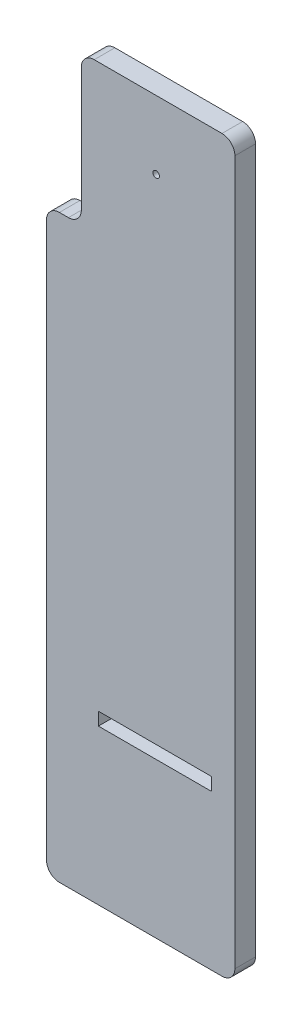
ISO-10303-21;
HEADER;
FILE_DESCRIPTION(('STEP AP214'),'2;1');
FILE_NAME('part.step','',(''),(''),'','','');
FILE_SCHEMA(('AUTOMOTIVE_DESIGN { 1 0 10303 214 1 1 1 1 }'));
ENDSEC;
DATA;
#1=APPLICATION_CONTEXT('core data for automotive mechanical design processes');
#2=APPLICATION_PROTOCOL_DEFINITION('international standard','automotive_design',2000,#1);
#3=PRODUCT_CONTEXT('',#1,'mechanical');
#4=PRODUCT('Part','Part','',(#3));
#5=PRODUCT_RELATED_PRODUCT_CATEGORY('part','',(#4));
#6=PRODUCT_DEFINITION_FORMATION('','',#4);
#7=PRODUCT_DEFINITION_CONTEXT('part definition',#1,'design');
#8=PRODUCT_DEFINITION('design','',#6,#7);
#9=PRODUCT_DEFINITION_SHAPE('','',#8);
#10=(LENGTH_UNIT() NAMED_UNIT(*) SI_UNIT(.MILLI.,.METRE.));
#11=(NAMED_UNIT(*) PLANE_ANGLE_UNIT() SI_UNIT($,.RADIAN.));
#12=(NAMED_UNIT(*) SI_UNIT($,.STERADIAN.) SOLID_ANGLE_UNIT());
#13=UNCERTAINTY_MEASURE_WITH_UNIT(LENGTH_MEASURE(1.E-05),#10,'distance_accuracy_value','');
#14=(GEOMETRIC_REPRESENTATION_CONTEXT(3) GLOBAL_UNCERTAINTY_ASSIGNED_CONTEXT((#13)) GLOBAL_UNIT_ASSIGNED_CONTEXT((#10,
#11,#12)) REPRESENTATION_CONTEXT('',''));
#15=CARTESIAN_POINT('',(0.,0.,0.));
#16=DIRECTION('',(0.,0.,1.));
#17=DIRECTION('',(1.,0.,0.));
#18=AXIS2_PLACEMENT_3D('',#15,#16,#17);
#19=CARTESIAN_POINT('',(0.,0.,1.6));
#20=DIRECTION('',(0.,0.,1.));
#21=DIRECTION('',(1.,0.,0.));
#22=AXIS2_PLACEMENT_3D('',#19,#20,#21);
#23=PLANE('',#22);
#24=DIRECTION('',(1.,0.,0.));
#25=VECTOR('',#24,1.);
#26=CARTESIAN_POINT('',(6.44999999999999,-22.48,1.6));
#27=LINE('',#26,#25);
#28=CARTESIAN_POINT('',(-7.15000000000001,-22.48,1.6));
#29=VERTEX_POINT('',#28);
#30=CARTESIAN_POINT('',(5.44999999999999,-22.48,1.6));
#31=VERTEX_POINT('',#30);
#32=EDGE_CURVE('E208',#29,#31,#27,.T.);
#33=ORIENTED_EDGE('',*,*,#32,.T.);
#34=CARTESIAN_POINT('',(5.44999999999999,-21.48,1.6));
#35=DIRECTION('',(0.,0.,1.));
#36=DIRECTION('',(1.,0.,0.));
#37=AXIS2_PLACEMENT_3D('',#34,#35,#36);
#38=CIRCLE('',#37,1.);
#39=CARTESIAN_POINT('',(6.44999999999999,-21.48,1.6));
#40=VERTEX_POINT('',#39);
#41=EDGE_CURVE('E247',#31,#40,#38,.T.);
#42=ORIENTED_EDGE('',*,*,#41,.T.);
#43=DIRECTION('',(0.,1.,0.));
#44=VECTOR('',#43,1.);
#45=CARTESIAN_POINT('',(6.44999999999999,-22.48,1.6));
#46=LINE('',#45,#44);
#47=CARTESIAN_POINT('',(6.44999999999999,33.08,1.6));
#48=VERTEX_POINT('',#47);
#49=EDGE_CURVE('E200',#40,#48,#46,.T.);
#50=ORIENTED_EDGE('',*,*,#49,.T.);
#51=CARTESIAN_POINT('',(5.44999999999999,33.08,1.6));
#52=DIRECTION('',(0.,0.,1.));
#53=DIRECTION('',(1.,0.,0.));
#54=AXIS2_PLACEMENT_3D('',#51,#52,#53);
#55=CIRCLE('',#54,1.);
#56=CARTESIAN_POINT('',(5.44999999999999,34.08,1.6));
#57=VERTEX_POINT('',#56);
#58=EDGE_CURVE('E63',#48,#57,#55,.T.);
#59=ORIENTED_EDGE('',*,*,#58,.T.);
#60=DIRECTION('',(-1.,0.,0.));
#61=VECTOR('',#60,1.);
#62=CARTESIAN_POINT('',(6.44999999999999,34.08,1.6));
#63=LINE('',#62,#61);
#64=CARTESIAN_POINT('',(-4.44999999999997,34.08,1.6));
#65=VERTEX_POINT('',#64);
#66=EDGE_CURVE('E202',#57,#65,#63,.T.);
#67=ORIENTED_EDGE('',*,*,#66,.T.);
#68=CARTESIAN_POINT('',(-4.44999999999997,33.08,1.6));
#69=DIRECTION('',(0.,0.,1.));
#70=DIRECTION('',(1.,0.,0.));
#71=AXIS2_PLACEMENT_3D('',#68,#69,#70);
#72=CIRCLE('',#71,1.);
#73=CARTESIAN_POINT('',(-5.44999999999997,33.08,1.6));
#74=VERTEX_POINT('',#73);
#75=EDGE_CURVE('E240',#65,#74,#72,.T.);
#76=ORIENTED_EDGE('',*,*,#75,.T.);
#77=DIRECTION('',(0.,-1.,0.));
#78=VECTOR('',#77,1.);
#79=CARTESIAN_POINT('',(-5.44999999999997,34.08,1.6));
#80=LINE('',#79,#78);
#81=CARTESIAN_POINT('',(-5.44999999999997,23.48,1.6));
#82=VERTEX_POINT('',#81);
#83=EDGE_CURVE('E291',#74,#82,#80,.T.);
#84=ORIENTED_EDGE('',*,*,#83,.T.);
#85=CARTESIAN_POINT('',(-6.44999999999997,23.48,1.6));
#86=DIRECTION('',(0.,0.,1.));
#87=DIRECTION('',(1.,0.,0.));
#88=AXIS2_PLACEMENT_3D('',#85,#86,#87);
#89=CIRCLE('',#88,1.);
#90=CARTESIAN_POINT('',(-6.44999999999997,22.48,1.6));
#91=VERTEX_POINT('',#90);
#92=EDGE_CURVE('E11',#82,#91,#89,.F.);
#93=ORIENTED_EDGE('',*,*,#92,.T.);
#94=DIRECTION('',(-1.,0.,0.));
#95=VECTOR('',#94,1.);
#96=CARTESIAN_POINT('',(-5.44999999999997,22.48,1.6));
#97=LINE('',#96,#95);
#98=CARTESIAN_POINT('',(-7.15000000000001,22.48,1.6));
#99=VERTEX_POINT('',#98);
#100=EDGE_CURVE('E289',#91,#99,#97,.T.);
#101=ORIENTED_EDGE('',*,*,#100,.T.);
#102=CARTESIAN_POINT('',(-7.15000000000001,21.48,1.6));
#103=DIRECTION('',(0.,0.,1.));
#104=DIRECTION('',(1.,0.,0.));
#105=AXIS2_PLACEMENT_3D('',#102,#103,#104);
#106=CIRCLE('',#105,1.);
#107=CARTESIAN_POINT('',(-8.15000000000001,21.48,1.6));
#108=VERTEX_POINT('',#107);
#109=EDGE_CURVE('E243',#99,#108,#106,.T.);
#110=ORIENTED_EDGE('',*,*,#109,.T.);
#111=DIRECTION('',(0.,-1.,0.));
#112=VECTOR('',#111,1.);
#113=CARTESIAN_POINT('',(-8.15000000000001,-22.48,1.6));
#114=LINE('',#113,#112);
#115=CARTESIAN_POINT('',(-8.15000000000001,-21.48,1.6));
#116=VERTEX_POINT('',#115);
#117=EDGE_CURVE('E205',#108,#116,#114,.T.);
#118=ORIENTED_EDGE('',*,*,#117,.T.);
#119=CARTESIAN_POINT('',(-7.15000000000001,-21.48,1.6));
#120=DIRECTION('',(0.,0.,1.));
#121=DIRECTION('',(1.,0.,0.));
#122=AXIS2_PLACEMENT_3D('',#119,#120,#121);
#123=CIRCLE('',#122,1.);
#124=EDGE_CURVE('E245',#116,#29,#123,.T.);
#125=ORIENTED_EDGE('',*,*,#124,.T.);
#126=EDGE_LOOP('',(#33,#42,#50,#59,#67,#76,#84,#93,#101,#110,#118,#125));
#127=FACE_BOUND('',#126,.T.);
#128=DIRECTION('',(-1.,0.,0.));
#129=VECTOR('',#128,1.);
#130=CARTESIAN_POINT('',(4.62499999999999,-9.48000000000001,1.6));
#131=LINE('',#130,#129);
#132=CARTESIAN_POINT('',(4.62499999999999,-9.48000000000001,1.6));
#133=VERTEX_POINT('',#132);
#134=CARTESIAN_POINT('',(-4.125,-9.48000000000001,1.6));
#135=VERTEX_POINT('',#134);
#136=EDGE_CURVE('E166',#133,#135,#131,.T.);
#137=ORIENTED_EDGE('',*,*,#136,.F.);
#138=DIRECTION('',(0.,1.,0.));
#139=VECTOR('',#138,1.);
#140=CARTESIAN_POINT('',(4.62499999999999,-10.48,1.6));
#141=LINE('',#140,#139);
#142=CARTESIAN_POINT('',(4.62499999999999,-10.48,1.6));
#143=VERTEX_POINT('',#142);
#144=EDGE_CURVE('E156',#143,#133,#141,.T.);
#145=ORIENTED_EDGE('',*,*,#144,.F.);
#146=DIRECTION('',(1.,0.,0.));
#147=VECTOR('',#146,1.);
#148=CARTESIAN_POINT('',(4.62499999999999,-10.48,1.6));
#149=LINE('',#148,#147);
#150=CARTESIAN_POINT('',(-4.125,-10.48,1.6));
#151=VERTEX_POINT('',#150);
#152=EDGE_CURVE('E182',#151,#143,#149,.T.);
#153=ORIENTED_EDGE('',*,*,#152,.F.);
#154=DIRECTION('',(0.,-1.,0.));
#155=VECTOR('',#154,1.);
#156=CARTESIAN_POINT('',(-4.125,-10.48,1.6));
#157=LINE('',#156,#155);
#158=EDGE_CURVE('E180',#135,#151,#157,.T.);
#159=ORIENTED_EDGE('',*,*,#158,.F.);
#160=EDGE_LOOP('',(#137,#145,#153,#159));
#161=FACE_BOUND('',#160,.T.);
#162=CARTESIAN_POINT('',(0.350000000000027,28.78,1.6));
#163=DIRECTION('',(0.,0.,1.));
#164=DIRECTION('',(1.,0.,0.));
#165=AXIS2_PLACEMENT_3D('',#162,#163,#164);
#166=CIRCLE('',#165,0.25);
#167=CARTESIAN_POINT('',(0.600000000000028,28.78,1.6));
#168=VERTEX_POINT('',#167);
#169=EDGE_CURVE('E189',#168,#168,#166,.T.);
#170=ORIENTED_EDGE('',*,*,#169,.F.);
#171=EDGE_LOOP('',(#170));
#172=FACE_BOUND('',#171,.T.);
#173=ADVANCED_FACE('F41',(#127,#161,#172),#23,.T.);
#174=CARTESIAN_POINT('',(0.,0.,0.));
#175=DIRECTION('',(0.,0.,1.));
#176=DIRECTION('',(1.,0.,0.));
#177=AXIS2_PLACEMENT_3D('',#174,#175,#176);
#178=PLANE('',#177);
#179=DIRECTION('',(0.,1.,0.));
#180=VECTOR('',#179,1.);
#181=CARTESIAN_POINT('',(6.44999999999999,-22.48,0.));
#182=LINE('',#181,#180);
#183=CARTESIAN_POINT('',(6.44999999999999,-21.48,0.));
#184=VERTEX_POINT('',#183);
#185=CARTESIAN_POINT('',(6.44999999999999,33.08,0.));
#186=VERTEX_POINT('',#185);
#187=EDGE_CURVE('E174',#184,#186,#182,.T.);
#188=ORIENTED_EDGE('',*,*,#187,.F.);
#189=CARTESIAN_POINT('',(5.44999999999999,-21.48,0.));
#190=DIRECTION('',(0.,0.,1.));
#191=DIRECTION('',(1.,0.,0.));
#192=AXIS2_PLACEMENT_3D('',#189,#190,#191);
#193=CIRCLE('',#192,1.);
#194=CARTESIAN_POINT('',(5.44999999999999,-22.48,0.));
#195=VERTEX_POINT('',#194);
#196=EDGE_CURVE('E233',#184,#195,#193,.F.);
#197=ORIENTED_EDGE('',*,*,#196,.T.);
#198=DIRECTION('',(1.,0.,0.));
#199=VECTOR('',#198,1.);
#200=CARTESIAN_POINT('',(6.44999999999999,-22.48,0.));
#201=LINE('',#200,#199);
#202=CARTESIAN_POINT('',(-7.15000000000001,-22.48,0.));
#203=VERTEX_POINT('',#202);
#204=EDGE_CURVE('E203',#203,#195,#201,.T.);
#205=ORIENTED_EDGE('',*,*,#204,.F.);
#206=CARTESIAN_POINT('',(-7.15000000000001,-21.48,0.));
#207=DIRECTION('',(0.,0.,1.));
#208=DIRECTION('',(1.,0.,0.));
#209=AXIS2_PLACEMENT_3D('',#206,#207,#208);
#210=CIRCLE('',#209,1.);
#211=CARTESIAN_POINT('',(-8.15000000000001,-21.48,0.));
#212=VERTEX_POINT('',#211);
#213=EDGE_CURVE('E231',#203,#212,#210,.F.);
#214=ORIENTED_EDGE('',*,*,#213,.T.);
#215=DIRECTION('',(0.,-1.,0.));
#216=VECTOR('',#215,1.);
#217=CARTESIAN_POINT('',(-8.15000000000001,-22.48,0.));
#218=LINE('',#217,#216);
#219=CARTESIAN_POINT('',(-8.15000000000001,21.48,0.));
#220=VERTEX_POINT('',#219);
#221=EDGE_CURVE('E216',#220,#212,#218,.T.);
#222=ORIENTED_EDGE('',*,*,#221,.F.);
#223=CARTESIAN_POINT('',(-7.15000000000001,21.48,0.));
#224=DIRECTION('',(0.,0.,1.));
#225=DIRECTION('',(1.,0.,0.));
#226=AXIS2_PLACEMENT_3D('',#223,#224,#225);
#227=CIRCLE('',#226,1.);
#228=CARTESIAN_POINT('',(-7.15000000000001,22.48,0.));
#229=VERTEX_POINT('',#228);
#230=EDGE_CURVE('E229',#220,#229,#227,.F.);
#231=ORIENTED_EDGE('',*,*,#230,.T.);
#232=DIRECTION('',(-1.,0.,0.));
#233=VECTOR('',#232,1.);
#234=CARTESIAN_POINT('',(-5.44999999999997,22.48,0.));
#235=LINE('',#234,#233);
#236=CARTESIAN_POINT('',(-6.44999999999997,22.48,0.));
#237=VERTEX_POINT('',#236);
#238=EDGE_CURVE('E276',#237,#229,#235,.T.);
#239=ORIENTED_EDGE('',*,*,#238,.F.);
#240=CARTESIAN_POINT('',(-6.44999999999997,23.48,0.));
#241=DIRECTION('',(0.,0.,1.));
#242=DIRECTION('',(1.,0.,0.));
#243=AXIS2_PLACEMENT_3D('',#240,#241,#242);
#244=CIRCLE('',#243,1.);
#245=CARTESIAN_POINT('',(-5.44999999999997,23.48,0.));
#246=VERTEX_POINT('',#245);
#247=EDGE_CURVE('E49',#237,#246,#244,.T.);
#248=ORIENTED_EDGE('',*,*,#247,.T.);
#249=DIRECTION('',(0.,-1.,0.));
#250=VECTOR('',#249,1.);
#251=CARTESIAN_POINT('',(-5.44999999999997,34.08,0.));
#252=LINE('',#251,#250);
#253=CARTESIAN_POINT('',(-5.44999999999997,33.08,0.));
#254=VERTEX_POINT('',#253);
#255=EDGE_CURVE('E274',#254,#246,#252,.T.);
#256=ORIENTED_EDGE('',*,*,#255,.F.);
#257=CARTESIAN_POINT('',(-4.44999999999997,33.08,0.));
#258=DIRECTION('',(0.,0.,1.));
#259=DIRECTION('',(1.,0.,0.));
#260=AXIS2_PLACEMENT_3D('',#257,#258,#259);
#261=CIRCLE('',#260,1.);
#262=CARTESIAN_POINT('',(-4.44999999999997,34.08,0.));
#263=VERTEX_POINT('',#262);
#264=EDGE_CURVE('E225',#254,#263,#261,.F.);
#265=ORIENTED_EDGE('',*,*,#264,.T.);
#266=DIRECTION('',(-1.,0.,0.));
#267=VECTOR('',#266,1.);
#268=CARTESIAN_POINT('',(6.44999999999999,34.08,0.));
#269=LINE('',#268,#267);
#270=CARTESIAN_POINT('',(5.44999999999999,34.08,0.));
#271=VERTEX_POINT('',#270);
#272=EDGE_CURVE('E214',#271,#263,#269,.T.);
#273=ORIENTED_EDGE('',*,*,#272,.F.);
#274=CARTESIAN_POINT('',(5.44999999999999,33.08,0.));
#275=DIRECTION('',(0.,0.,1.));
#276=DIRECTION('',(1.,0.,0.));
#277=AXIS2_PLACEMENT_3D('',#274,#275,#276);
#278=CIRCLE('',#277,1.);
#279=EDGE_CURVE('E227',#271,#186,#278,.F.);
#280=ORIENTED_EDGE('',*,*,#279,.T.);
#281=EDGE_LOOP('',(#188,#197,#205,#214,#222,#231,#239,#248,#256,#265,#273,#280));
#282=FACE_BOUND('',#281,.T.);
#283=DIRECTION('',(0.,1.,0.));
#284=VECTOR('',#283,1.);
#285=CARTESIAN_POINT('',(4.62499999999999,-10.48,0.));
#286=LINE('',#285,#284);
#287=CARTESIAN_POINT('',(4.62499999999999,-10.48,0.));
#288=VERTEX_POINT('',#287);
#289=CARTESIAN_POINT('',(4.62499999999999,-9.48000000000001,0.));
#290=VERTEX_POINT('',#289);
#291=EDGE_CURVE('E187',#288,#290,#286,.T.);
#292=ORIENTED_EDGE('',*,*,#291,.T.);
#293=DIRECTION('',(-1.,0.,0.));
#294=VECTOR('',#293,1.);
#295=CARTESIAN_POINT('',(4.62499999999999,-9.48000000000001,0.));
#296=LINE('',#295,#294);
#297=CARTESIAN_POINT('',(-4.125,-9.48000000000001,0.));
#298=VERTEX_POINT('',#297);
#299=EDGE_CURVE('E173',#290,#298,#296,.T.);
#300=ORIENTED_EDGE('',*,*,#299,.T.);
#301=DIRECTION('',(0.,-1.,0.));
#302=VECTOR('',#301,1.);
#303=CARTESIAN_POINT('',(-4.125,-10.48,0.));
#304=LINE('',#303,#302);
#305=CARTESIAN_POINT('',(-4.125,-10.48,0.));
#306=VERTEX_POINT('',#305);
#307=EDGE_CURVE('E191',#298,#306,#304,.T.);
#308=ORIENTED_EDGE('',*,*,#307,.T.);
#309=DIRECTION('',(1.,0.,0.));
#310=VECTOR('',#309,1.);
#311=CARTESIAN_POINT('',(4.62499999999999,-10.48,0.));
#312=LINE('',#311,#310);
#313=EDGE_CURVE('E167',#306,#288,#312,.T.);
#314=ORIENTED_EDGE('',*,*,#313,.T.);
#315=EDGE_LOOP('',(#292,#300,#308,#314));
#316=FACE_BOUND('',#315,.T.);
#317=CARTESIAN_POINT('',(0.350000000000027,28.78,0.));
#318=DIRECTION('',(0.,0.,1.));
#319=DIRECTION('',(1.,0.,0.));
#320=AXIS2_PLACEMENT_3D('',#317,#318,#319);
#321=CIRCLE('',#320,0.25);
#322=CARTESIAN_POINT('',(0.600000000000028,28.78,0.));
#323=VERTEX_POINT('',#322);
#324=EDGE_CURVE('E295',#323,#323,#321,.T.);
#325=ORIENTED_EDGE('',*,*,#324,.T.);
#326=EDGE_LOOP('',(#325));
#327=FACE_BOUND('',#326,.T.);
#328=ADVANCED_FACE('F272',(#282,#316,#327),#178,.F.);
#329=CARTESIAN_POINT('',(6.44999999999999,-22.48,1.6));
#330=DIRECTION('',(-1.,0.,0.));
#331=DIRECTION('',(0.,0.,1.));
#332=AXIS2_PLACEMENT_3D('',#329,#330,#331);
#333=PLANE('',#332);
#334=ORIENTED_EDGE('',*,*,#49,.F.);
#335=DIRECTION('',(0.,0.,-1.));
#336=VECTOR('',#335,1.);
#337=CARTESIAN_POINT('',(6.44999999999999,-21.48,1.6));
#338=LINE('',#337,#336);
#339=EDGE_CURVE('E222',#40,#184,#338,.T.);
#340=ORIENTED_EDGE('',*,*,#339,.T.);
#341=ORIENTED_EDGE('',*,*,#187,.T.);
#342=DIRECTION('',(0.,0.,-1.));
#343=VECTOR('',#342,1.);
#344=CARTESIAN_POINT('',(6.44999999999999,33.08,1.6));
#345=LINE('',#344,#343);
#346=EDGE_CURVE('E211',#186,#48,#345,.F.);
#347=ORIENTED_EDGE('',*,*,#346,.T.);
#348=EDGE_LOOP('',(#334,#340,#341,#347));
#349=FACE_BOUND('',#348,.T.);
#350=ADVANCED_FACE('F312',(#349),#333,.F.);
#351=CARTESIAN_POINT('',(6.44999999999999,34.08,1.6));
#352=DIRECTION('',(0.,-1.,0.));
#353=DIRECTION('',(0.,0.,-1.));
#354=AXIS2_PLACEMENT_3D('',#351,#352,#353);
#355=PLANE('',#354);
#356=ORIENTED_EDGE('',*,*,#66,.F.);
#357=DIRECTION('',(0.,0.,-1.));
#358=VECTOR('',#357,1.);
#359=CARTESIAN_POINT('',(5.44999999999999,34.08,1.6));
#360=LINE('',#359,#358);
#361=EDGE_CURVE('E260',#57,#271,#360,.T.);
#362=ORIENTED_EDGE('',*,*,#361,.T.);
#363=ORIENTED_EDGE('',*,*,#272,.T.);
#364=DIRECTION('',(0.,0.,-1.));
#365=VECTOR('',#364,1.);
#366=CARTESIAN_POINT('',(-4.44999999999997,34.08,1.6));
#367=LINE('',#366,#365);
#368=EDGE_CURVE('E56',#263,#65,#367,.F.);
#369=ORIENTED_EDGE('',*,*,#368,.T.);
#370=EDGE_LOOP('',(#356,#362,#363,#369));
#371=FACE_BOUND('',#370,.T.);
#372=ADVANCED_FACE('F324',(#371),#355,.F.);
#373=CARTESIAN_POINT('',(-8.15000000000001,-22.48,1.6));
#374=DIRECTION('',(1.,0.,0.));
#375=DIRECTION('',(0.,0.,-1.));
#376=AXIS2_PLACEMENT_3D('',#373,#374,#375);
#377=PLANE('',#376);
#378=ORIENTED_EDGE('',*,*,#221,.T.);
#379=DIRECTION('',(0.,0.,-1.));
#380=VECTOR('',#379,1.);
#381=CARTESIAN_POINT('',(-8.15000000000001,-21.48,1.6));
#382=LINE('',#381,#380);
#383=EDGE_CURVE('E252',#212,#116,#382,.F.);
#384=ORIENTED_EDGE('',*,*,#383,.T.);
#385=ORIENTED_EDGE('',*,*,#117,.F.);
#386=DIRECTION('',(0.,0.,-1.));
#387=VECTOR('',#386,1.);
#388=CARTESIAN_POINT('',(-8.15000000000001,21.48,1.6));
#389=LINE('',#388,#387);
#390=EDGE_CURVE('E249',#108,#220,#389,.T.);
#391=ORIENTED_EDGE('',*,*,#390,.T.);
#392=EDGE_LOOP('',(#378,#384,#385,#391));
#393=FACE_BOUND('',#392,.T.);
#394=ADVANCED_FACE('F320',(#393),#377,.F.);
#395=CARTESIAN_POINT('',(6.44999999999999,-22.48,1.6));
#396=DIRECTION('',(0.,1.,0.));
#397=DIRECTION('',(-1.,0.,0.));
#398=AXIS2_PLACEMENT_3D('',#395,#396,#397);
#399=PLANE('',#398);
#400=ORIENTED_EDGE('',*,*,#204,.T.);
#401=DIRECTION('',(0.,0.,-1.));
#402=VECTOR('',#401,1.);
#403=CARTESIAN_POINT('',(5.44999999999999,-22.48,1.6));
#404=LINE('',#403,#402);
#405=EDGE_CURVE('E238',#195,#31,#404,.F.);
#406=ORIENTED_EDGE('',*,*,#405,.T.);
#407=ORIENTED_EDGE('',*,*,#32,.F.);
#408=DIRECTION('',(0.,0.,-1.));
#409=VECTOR('',#408,1.);
#410=CARTESIAN_POINT('',(-7.15000000000001,-22.48,1.6));
#411=LINE('',#410,#409);
#412=EDGE_CURVE('E235',#29,#203,#411,.T.);
#413=ORIENTED_EDGE('',*,*,#412,.T.);
#414=EDGE_LOOP('',(#400,#406,#407,#413));
#415=FACE_BOUND('',#414,.T.);
#416=ADVANCED_FACE('F317',(#415),#399,.F.);
#417=CARTESIAN_POINT('',(4.62499999999999,-10.48,1.6));
#418=DIRECTION('',(-1.,0.,0.));
#419=DIRECTION('',(0.,0.,1.));
#420=AXIS2_PLACEMENT_3D('',#417,#418,#419);
#421=PLANE('',#420);
#422=ORIENTED_EDGE('',*,*,#291,.F.);
#423=DIRECTION('',(0.,0.,-1.));
#424=VECTOR('',#423,1.);
#425=CARTESIAN_POINT('',(4.62499999999999,-10.48,1.6));
#426=LINE('',#425,#424);
#427=EDGE_CURVE('E162',#143,#288,#426,.T.);
#428=ORIENTED_EDGE('',*,*,#427,.F.);
#429=ORIENTED_EDGE('',*,*,#144,.T.);
#430=DIRECTION('',(0.,0.,-1.));
#431=VECTOR('',#430,1.);
#432=CARTESIAN_POINT('',(4.62499999999999,-9.48000000000001,1.6));
#433=LINE('',#432,#431);
#434=EDGE_CURVE('E159',#133,#290,#433,.T.);
#435=ORIENTED_EDGE('',*,*,#434,.T.);
#436=EDGE_LOOP('',(#422,#428,#429,#435));
#437=FACE_BOUND('',#436,.T.);
#438=ADVANCED_FACE('F158',(#437),#421,.T.);
#439=CARTESIAN_POINT('',(4.62499999999999,-9.48000000000001,1.6));
#440=DIRECTION('',(0.,-1.,0.));
#441=DIRECTION('',(0.,0.,-1.));
#442=AXIS2_PLACEMENT_3D('',#439,#440,#441);
#443=PLANE('',#442);
#444=ORIENTED_EDGE('',*,*,#299,.F.);
#445=ORIENTED_EDGE('',*,*,#434,.F.);
#446=ORIENTED_EDGE('',*,*,#136,.T.);
#447=DIRECTION('',(0.,0.,-1.));
#448=VECTOR('',#447,1.);
#449=CARTESIAN_POINT('',(-4.125,-9.48000000000001,1.6));
#450=LINE('',#449,#448);
#451=EDGE_CURVE('E175',#135,#298,#450,.T.);
#452=ORIENTED_EDGE('',*,*,#451,.T.);
#453=EDGE_LOOP('',(#444,#445,#446,#452));
#454=FACE_BOUND('',#453,.T.);
#455=ADVANCED_FACE('F170',(#454),#443,.T.);
#456=CARTESIAN_POINT('',(-4.125,-10.48,1.6));
#457=DIRECTION('',(1.,0.,0.));
#458=DIRECTION('',(0.,0.,-1.));
#459=AXIS2_PLACEMENT_3D('',#456,#457,#458);
#460=PLANE('',#459);
#461=ORIENTED_EDGE('',*,*,#307,.F.);
#462=ORIENTED_EDGE('',*,*,#451,.F.);
#463=ORIENTED_EDGE('',*,*,#158,.T.);
#464=DIRECTION('',(0.,0.,-1.));
#465=VECTOR('',#464,1.);
#466=CARTESIAN_POINT('',(-4.125,-10.48,1.6));
#467=LINE('',#466,#465);
#468=EDGE_CURVE('E197',#151,#306,#467,.T.);
#469=ORIENTED_EDGE('',*,*,#468,.T.);
#470=EDGE_LOOP('',(#461,#462,#463,#469));
#471=FACE_BOUND('',#470,.T.);
#472=ADVANCED_FACE('F432',(#471),#460,.T.);
#473=CARTESIAN_POINT('',(4.62499999999999,-10.48,1.6));
#474=DIRECTION('',(0.,1.,0.));
#475=DIRECTION('',(-1.,0.,0.));
#476=AXIS2_PLACEMENT_3D('',#473,#474,#475);
#477=PLANE('',#476);
#478=ORIENTED_EDGE('',*,*,#313,.F.);
#479=ORIENTED_EDGE('',*,*,#468,.F.);
#480=ORIENTED_EDGE('',*,*,#152,.T.);
#481=ORIENTED_EDGE('',*,*,#427,.T.);
#482=EDGE_LOOP('',(#478,#479,#480,#481));
#483=FACE_BOUND('',#482,.T.);
#484=ADVANCED_FACE('F423',(#483),#477,.T.);
#485=CARTESIAN_POINT('',(0.350000000000027,28.78,1.6));
#486=DIRECTION('',(0.,0.,-1.));
#487=DIRECTION('',(-1.,0.,0.));
#488=AXIS2_PLACEMENT_3D('',#485,#486,#487);
#489=CYLINDRICAL_SURFACE('',#488,0.25);
#490=ORIENTED_EDGE('',*,*,#169,.T.);
#491=EDGE_LOOP('',(#490));
#492=FACE_BOUND('',#491,.T.);
#493=ORIENTED_EDGE('',*,*,#324,.F.);
#494=EDGE_LOOP('',(#493));
#495=FACE_BOUND('',#494,.T.);
#496=ADVANCED_FACE('F304',(#492,#495),#489,.F.);
#497=CARTESIAN_POINT('',(-5.44999999999997,34.08,1.6));
#498=DIRECTION('',(1.,0.,0.));
#499=DIRECTION('',(0.,1.,0.));
#500=AXIS2_PLACEMENT_3D('',#497,#498,#499);
#501=PLANE('',#500);
#502=ORIENTED_EDGE('',*,*,#83,.F.);
#503=DIRECTION('',(0.,0.,-1.));
#504=VECTOR('',#503,1.);
#505=CARTESIAN_POINT('',(-5.44999999999997,33.08,1.6));
#506=LINE('',#505,#504);
#507=EDGE_CURVE('E265',#74,#254,#506,.T.);
#508=ORIENTED_EDGE('',*,*,#507,.T.);
#509=ORIENTED_EDGE('',*,*,#255,.T.);
#510=DIRECTION('',(0.,0.,-1.));
#511=VECTOR('',#510,1.);
#512=CARTESIAN_POINT('',(-5.44999999999997,23.48,1.6));
#513=LINE('',#512,#511);
#514=EDGE_CURVE('E263',#246,#82,#513,.F.);
#515=ORIENTED_EDGE('',*,*,#514,.T.);
#516=EDGE_LOOP('',(#502,#508,#509,#515));
#517=FACE_BOUND('',#516,.T.);
#518=ADVANCED_FACE('F282',(#517),#501,.F.);
#519=CARTESIAN_POINT('',(-5.44999999999997,22.48,1.6));
#520=DIRECTION('',(0.,-1.,0.));
#521=DIRECTION('',(0.,0.,-1.));
#522=AXIS2_PLACEMENT_3D('',#519,#520,#521);
#523=PLANE('',#522);
#524=ORIENTED_EDGE('',*,*,#238,.T.);
#525=DIRECTION('',(0.,0.,-1.));
#526=VECTOR('',#525,1.);
#527=CARTESIAN_POINT('',(-7.15000000000001,22.48,1.6));
#528=LINE('',#527,#526);
#529=EDGE_CURVE('E257',#229,#99,#528,.F.);
#530=ORIENTED_EDGE('',*,*,#529,.T.);
#531=ORIENTED_EDGE('',*,*,#100,.F.);
#532=DIRECTION('',(0.,0.,-1.));
#533=VECTOR('',#532,1.);
#534=CARTESIAN_POINT('',(-6.44999999999997,22.48,0.));
#535=LINE('',#534,#533);
#536=EDGE_CURVE('E254',#91,#237,#535,.T.);
#537=ORIENTED_EDGE('',*,*,#536,.T.);
#538=EDGE_LOOP('',(#524,#530,#531,#537));
#539=FACE_BOUND('',#538,.T.);
#540=ADVANCED_FACE('F293',(#539),#523,.F.);
#541=CARTESIAN_POINT('',(5.44999999999999,-21.48,1.6));
#542=DIRECTION('',(0.,0.,-1.));
#543=DIRECTION('',(-1.,0.,0.));
#544=AXIS2_PLACEMENT_3D('',#541,#542,#543);
#545=CYLINDRICAL_SURFACE('',#544,1.);
#546=ORIENTED_EDGE('',*,*,#41,.F.);
#547=ORIENTED_EDGE('',*,*,#405,.F.);
#548=ORIENTED_EDGE('',*,*,#196,.F.);
#549=ORIENTED_EDGE('',*,*,#339,.F.);
#550=EDGE_LOOP('',(#546,#547,#548,#549));
#551=FACE_BOUND('',#550,.T.);
#552=ADVANCED_FACE('F331',(#551),#545,.T.);
#553=CARTESIAN_POINT('',(-7.15000000000001,-21.48,1.6));
#554=DIRECTION('',(0.,0.,-1.));
#555=DIRECTION('',(-1.,0.,0.));
#556=AXIS2_PLACEMENT_3D('',#553,#554,#555);
#557=CYLINDRICAL_SURFACE('',#556,1.);
#558=ORIENTED_EDGE('',*,*,#124,.F.);
#559=ORIENTED_EDGE('',*,*,#383,.F.);
#560=ORIENTED_EDGE('',*,*,#213,.F.);
#561=ORIENTED_EDGE('',*,*,#412,.F.);
#562=EDGE_LOOP('',(#558,#559,#560,#561));
#563=FACE_BOUND('',#562,.T.);
#564=ADVANCED_FACE('F334',(#563),#557,.T.);
#565=CARTESIAN_POINT('',(-7.15000000000001,21.48,1.6));
#566=DIRECTION('',(0.,0.,-1.));
#567=DIRECTION('',(-1.,0.,0.));
#568=AXIS2_PLACEMENT_3D('',#565,#566,#567);
#569=CYLINDRICAL_SURFACE('',#568,1.);
#570=ORIENTED_EDGE('',*,*,#109,.F.);
#571=ORIENTED_EDGE('',*,*,#529,.F.);
#572=ORIENTED_EDGE('',*,*,#230,.F.);
#573=ORIENTED_EDGE('',*,*,#390,.F.);
#574=EDGE_LOOP('',(#570,#571,#572,#573));
#575=FACE_BOUND('',#574,.T.);
#576=ADVANCED_FACE('F338',(#575),#569,.T.);
#577=CARTESIAN_POINT('',(5.44999999999999,33.08,1.6));
#578=DIRECTION('',(0.,0.,-1.));
#579=DIRECTION('',(-1.,0.,0.));
#580=AXIS2_PLACEMENT_3D('',#577,#578,#579);
#581=CYLINDRICAL_SURFACE('',#580,1.);
#582=ORIENTED_EDGE('',*,*,#58,.F.);
#583=ORIENTED_EDGE('',*,*,#346,.F.);
#584=ORIENTED_EDGE('',*,*,#279,.F.);
#585=ORIENTED_EDGE('',*,*,#361,.F.);
#586=EDGE_LOOP('',(#582,#583,#584,#585));
#587=FACE_BOUND('',#586,.T.);
#588=ADVANCED_FACE('F342',(#587),#581,.T.);
#589=CARTESIAN_POINT('',(-4.44999999999997,33.08,1.6));
#590=DIRECTION('',(0.,0.,-1.));
#591=DIRECTION('',(-1.,0.,0.));
#592=AXIS2_PLACEMENT_3D('',#589,#590,#591);
#593=CYLINDRICAL_SURFACE('',#592,1.);
#594=ORIENTED_EDGE('',*,*,#75,.F.);
#595=ORIENTED_EDGE('',*,*,#368,.F.);
#596=ORIENTED_EDGE('',*,*,#264,.F.);
#597=ORIENTED_EDGE('',*,*,#507,.F.);
#598=EDGE_LOOP('',(#594,#595,#596,#597));
#599=FACE_BOUND('',#598,.T.);
#600=ADVANCED_FACE('F345',(#599),#593,.T.);
#601=CARTESIAN_POINT('',(-6.44999999999997,23.48,1.6));
#602=DIRECTION('',(0.,0.,1.));
#603=DIRECTION('',(1.,0.,0.));
#604=AXIS2_PLACEMENT_3D('',#601,#602,#603);
#605=CYLINDRICAL_SURFACE('',#604,1.);
#606=ORIENTED_EDGE('',*,*,#92,.F.);
#607=ORIENTED_EDGE('',*,*,#514,.F.);
#608=ORIENTED_EDGE('',*,*,#247,.F.);
#609=ORIENTED_EDGE('',*,*,#536,.F.);
#610=EDGE_LOOP('',(#606,#607,#608,#609));
#611=FACE_BOUND('',#610,.T.);
#612=ADVANCED_FACE('F43',(#611),#605,.F.);
#613=CLOSED_SHELL('',(#173,#328,#350,#372,#394,#416,#438,#455,#472,#484,#496,#518,#540,#552,
#564,#576,#588,#600,#612));
#614=MANIFOLD_SOLID_BREP('B2',#613);
#615=ADVANCED_BREP_SHAPE_REPRESENTATION('',(#18,#614),#14);
#616=SHAPE_DEFINITION_REPRESENTATION(#9,#615);
ENDSEC;
END-ISO-10303-21;
